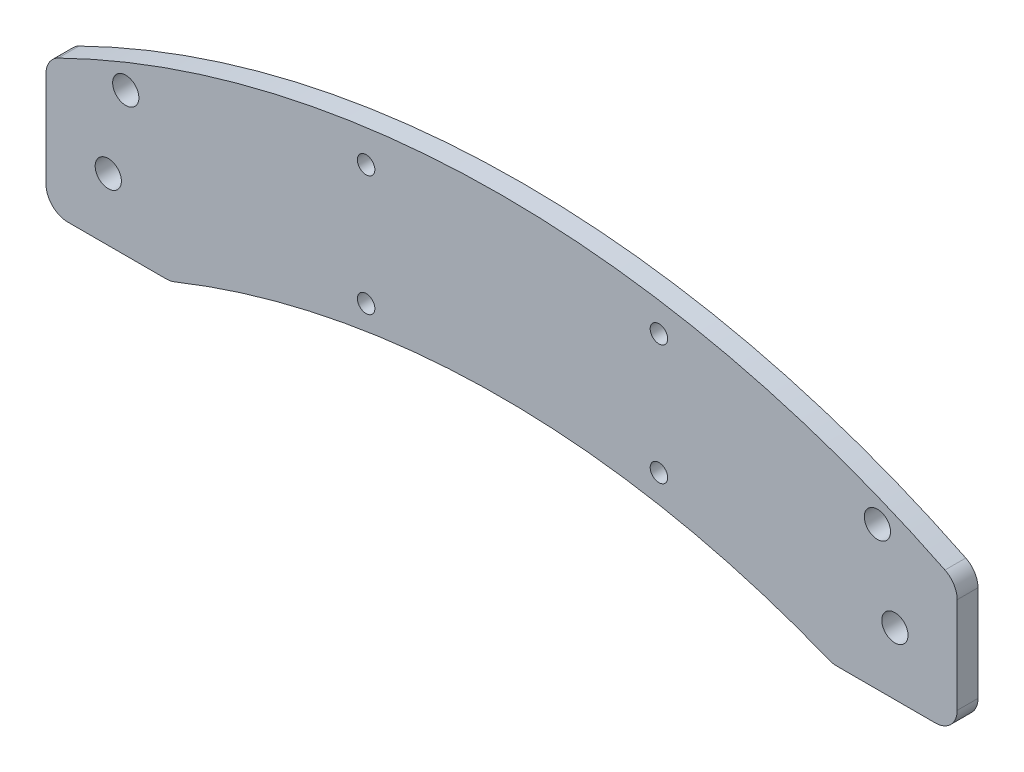
ISO-10303-21;
HEADER;
FILE_DESCRIPTION(('STEP AP214'),'2;1');
FILE_NAME('part.step','',(''),(''),'','','');
FILE_SCHEMA(('AUTOMOTIVE_DESIGN { 1 0 10303 214 1 1 1 1 }'));
ENDSEC;
DATA;
#1=APPLICATION_CONTEXT('core data for automotive mechanical design processes');
#2=APPLICATION_PROTOCOL_DEFINITION('international standard','automotive_design',2000,#1);
#3=PRODUCT_CONTEXT('',#1,'mechanical');
#4=PRODUCT('Part','Part','',(#3));
#5=PRODUCT_RELATED_PRODUCT_CATEGORY('part','',(#4));
#6=PRODUCT_DEFINITION_FORMATION('','',#4);
#7=PRODUCT_DEFINITION_CONTEXT('part definition',#1,'design');
#8=PRODUCT_DEFINITION('design','',#6,#7);
#9=PRODUCT_DEFINITION_SHAPE('','',#8);
#10=(LENGTH_UNIT() NAMED_UNIT(*) SI_UNIT(.MILLI.,.METRE.));
#11=(NAMED_UNIT(*) PLANE_ANGLE_UNIT() SI_UNIT($,.RADIAN.));
#12=(NAMED_UNIT(*) SI_UNIT($,.STERADIAN.) SOLID_ANGLE_UNIT());
#13=UNCERTAINTY_MEASURE_WITH_UNIT(LENGTH_MEASURE(1.E-05),#10,'distance_accuracy_value','');
#14=(GEOMETRIC_REPRESENTATION_CONTEXT(3) GLOBAL_UNCERTAINTY_ASSIGNED_CONTEXT((#13)) GLOBAL_UNIT_ASSIGNED_CONTEXT((#10,
#11,#12)) REPRESENTATION_CONTEXT('',''));
#15=CARTESIAN_POINT('',(0.,0.,0.));
#16=DIRECTION('',(0.,0.,1.));
#17=DIRECTION('',(1.,0.,0.));
#18=AXIS2_PLACEMENT_3D('',#15,#16,#17);
#19=CARTESIAN_POINT('',(86.,32.75,4.763));
#20=DIRECTION('',(0.,0.,1.));
#21=DIRECTION('',(1.,0.,0.));
#22=AXIS2_PLACEMENT_3D('',#19,#20,#21);
#23=CYLINDRICAL_SURFACE('',#22,3.);
#24=CARTESIAN_POINT('',(86.00000000001,32.75000000001,4.76300000001));
#25=DIRECTION('',(0.,0.,-1.));
#26=DIRECTION('',(1.,0.,0.));
#27=AXIS2_PLACEMENT_3D('',#24,#25,#26);
#28=CIRCLE('',#27,3.00000000001);
#29=CARTESIAN_POINT('',(89.00000000002,32.75000000001,4.76300000001));
#30=VERTEX_POINT('',#29);
#31=EDGE_CURVE('E269',#30,#30,#28,.T.);
#32=ORIENTED_EDGE('',*,*,#31,.F.);
#33=EDGE_LOOP('',(#32));
#34=FACE_BOUND('',#33,.T.);
#35=CARTESIAN_POINT('',(86.00000000001,32.75000000001,0.));
#36=DIRECTION('',(0.,0.,1.));
#37=DIRECTION('',(1.,0.,0.));
#38=AXIS2_PLACEMENT_3D('',#35,#36,#37);
#39=CIRCLE('',#38,3.00000000001);
#40=CARTESIAN_POINT('',(89.00000000002,32.75000000001,0.));
#41=VERTEX_POINT('',#40);
#42=EDGE_CURVE('E248',#41,#41,#39,.T.);
#43=ORIENTED_EDGE('',*,*,#42,.F.);
#44=EDGE_LOOP('',(#43));
#45=FACE_BOUND('',#44,.T.);
#46=ADVANCED_FACE('F17',(#34,#45),#23,.F.);
#47=CARTESIAN_POINT('',(-85.99999999998,32.75,4.763));
#48=DIRECTION('',(0.,0.,1.));
#49=DIRECTION('',(1.,0.,0.));
#50=AXIS2_PLACEMENT_3D('',#47,#48,#49);
#51=CYLINDRICAL_SURFACE('',#50,3.);
#52=CARTESIAN_POINT('',(-85.99999999999,32.75000000001,4.76300000001));
#53=DIRECTION('',(0.,0.,-1.));
#54=DIRECTION('',(1.,0.,0.));
#55=AXIS2_PLACEMENT_3D('',#52,#53,#54);
#56=CIRCLE('',#55,3.00000000001);
#57=CARTESIAN_POINT('',(-82.99999999998,32.75000000001,4.76300000001));
#58=VERTEX_POINT('',#57);
#59=EDGE_CURVE('E185',#58,#58,#56,.T.);
#60=ORIENTED_EDGE('',*,*,#59,.F.);
#61=EDGE_LOOP('',(#60));
#62=FACE_BOUND('',#61,.T.);
#63=CARTESIAN_POINT('',(-85.99999999999,32.75000000001,0.));
#64=DIRECTION('',(0.,0.,1.));
#65=DIRECTION('',(1.,0.,0.));
#66=AXIS2_PLACEMENT_3D('',#63,#64,#65);
#67=CIRCLE('',#66,3.00000000001);
#68=CARTESIAN_POINT('',(-82.99999999998,32.75000000001,0.));
#69=VERTEX_POINT('',#68);
#70=EDGE_CURVE('E242',#69,#69,#67,.T.);
#71=ORIENTED_EDGE('',*,*,#70,.F.);
#72=EDGE_LOOP('',(#71));
#73=FACE_BOUND('',#72,.T.);
#74=ADVANCED_FACE('F347',(#62,#73),#51,.F.);
#75=CARTESIAN_POINT('',(36.000000000011,45.5,4.763));
#76=DIRECTION('',(0.,0.,1.));
#77=DIRECTION('',(1.,0.,0.));
#78=AXIS2_PLACEMENT_3D('',#75,#76,#77);
#79=CYLINDRICAL_SURFACE('',#78,2.);
#80=CARTESIAN_POINT('',(36.000000000021,45.50000000001,4.76300000001));
#81=DIRECTION('',(0.,0.,-1.));
#82=DIRECTION('',(1.,0.,0.));
#83=AXIS2_PLACEMENT_3D('',#80,#81,#82);
#84=CIRCLE('',#83,2.00000000001);
#85=CARTESIAN_POINT('',(38.000000000031,45.50000000001,4.76300000001));
#86=VERTEX_POINT('',#85);
#87=EDGE_CURVE('E202',#86,#86,#84,.T.);
#88=ORIENTED_EDGE('',*,*,#87,.F.);
#89=EDGE_LOOP('',(#88));
#90=FACE_BOUND('',#89,.T.);
#91=CARTESIAN_POINT('',(36.000000000021,45.50000000001,0.));
#92=DIRECTION('',(0.,0.,1.));
#93=DIRECTION('',(1.,0.,0.));
#94=AXIS2_PLACEMENT_3D('',#91,#92,#93);
#95=CIRCLE('',#94,2.00000000001);
#96=CARTESIAN_POINT('',(38.000000000031,45.50000000001,0.));
#97=VERTEX_POINT('',#96);
#98=EDGE_CURVE('E227',#97,#97,#95,.T.);
#99=ORIENTED_EDGE('',*,*,#98,.F.);
#100=EDGE_LOOP('',(#99));
#101=FACE_BOUND('',#100,.T.);
#102=ADVANCED_FACE('F353',(#90,#101),#79,.F.);
#103=CARTESIAN_POINT('',(-30.99999999998,45.5,4.763));
#104=DIRECTION('',(0.,0.,1.));
#105=DIRECTION('',(1.,0.,0.));
#106=AXIS2_PLACEMENT_3D('',#103,#104,#105);
#107=CYLINDRICAL_SURFACE('',#106,2.);
#108=CARTESIAN_POINT('',(-30.99999999999,45.50000000001,4.76300000001));
#109=DIRECTION('',(0.,0.,-1.));
#110=DIRECTION('',(1.,0.,0.));
#111=AXIS2_PLACEMENT_3D('',#108,#109,#110);
#112=CIRCLE('',#111,2.00000000001);
#113=CARTESIAN_POINT('',(-28.99999999998,45.50000000001,4.76300000001));
#114=VERTEX_POINT('',#113);
#115=EDGE_CURVE('E206',#114,#114,#112,.T.);
#116=ORIENTED_EDGE('',*,*,#115,.F.);
#117=EDGE_LOOP('',(#116));
#118=FACE_BOUND('',#117,.T.);
#119=CARTESIAN_POINT('',(-30.99999999999,45.50000000001,0.));
#120=DIRECTION('',(0.,0.,1.));
#121=DIRECTION('',(1.,0.,0.));
#122=AXIS2_PLACEMENT_3D('',#119,#120,#121);
#123=CIRCLE('',#122,2.00000000001);
#124=CARTESIAN_POINT('',(-28.99999999998,45.50000000001,0.));
#125=VERTEX_POINT('',#124);
#126=EDGE_CURVE('E223',#125,#125,#123,.T.);
#127=ORIENTED_EDGE('',*,*,#126,.F.);
#128=EDGE_LOOP('',(#127));
#129=FACE_BOUND('',#128,.T.);
#130=ADVANCED_FACE('F386',(#118,#129),#107,.F.);
#131=CARTESIAN_POINT('',(-89.99999999998,14.25,4.763));
#132=DIRECTION('',(0.,0.,1.));
#133=DIRECTION('',(1.,0.,0.));
#134=AXIS2_PLACEMENT_3D('',#131,#132,#133);
#135=CYLINDRICAL_SURFACE('',#134,3.);
#136=CARTESIAN_POINT('',(-89.99999999999,14.25000000001,4.76300000001));
#137=DIRECTION('',(0.,0.,-1.));
#138=DIRECTION('',(1.,0.,0.));
#139=AXIS2_PLACEMENT_3D('',#136,#137,#138);
#140=CIRCLE('',#139,3.00000000001);
#141=CARTESIAN_POINT('',(-86.99999999998,14.25000000001,4.76300000001));
#142=VERTEX_POINT('',#141);
#143=EDGE_CURVE('E212',#142,#142,#140,.T.);
#144=ORIENTED_EDGE('',*,*,#143,.F.);
#145=EDGE_LOOP('',(#144));
#146=FACE_BOUND('',#145,.T.);
#147=CARTESIAN_POINT('',(-89.99999999999,14.25000000001,0.));
#148=DIRECTION('',(0.,0.,1.));
#149=DIRECTION('',(1.,0.,0.));
#150=AXIS2_PLACEMENT_3D('',#147,#148,#149);
#151=CIRCLE('',#150,3.00000000001);
#152=CARTESIAN_POINT('',(-86.99999999998,14.25000000001,0.));
#153=VERTEX_POINT('',#152);
#154=EDGE_CURVE('E200',#153,#153,#151,.T.);
#155=ORIENTED_EDGE('',*,*,#154,.F.);
#156=EDGE_LOOP('',(#155));
#157=FACE_BOUND('',#156,.T.);
#158=ADVANCED_FACE('F389',(#146,#157),#135,.F.);
#159=CARTESIAN_POINT('',(90.,14.25,4.763));
#160=DIRECTION('',(0.,0.,1.));
#161=DIRECTION('',(1.,0.,0.));
#162=AXIS2_PLACEMENT_3D('',#159,#160,#161);
#163=CYLINDRICAL_SURFACE('',#162,3.);
#164=CARTESIAN_POINT('',(90.00000000001,14.25000000001,4.76300000001));
#165=DIRECTION('',(0.,0.,-1.));
#166=DIRECTION('',(1.,0.,0.));
#167=AXIS2_PLACEMENT_3D('',#164,#165,#166);
#168=CIRCLE('',#167,3.00000000001);
#169=CARTESIAN_POINT('',(93.00000000002,14.25000000001,4.76300000001));
#170=VERTEX_POINT('',#169);
#171=EDGE_CURVE('E274',#170,#170,#168,.T.);
#172=ORIENTED_EDGE('',*,*,#171,.F.);
#173=EDGE_LOOP('',(#172));
#174=FACE_BOUND('',#173,.T.);
#175=CARTESIAN_POINT('',(90.00000000001,14.25000000001,0.));
#176=DIRECTION('',(0.,0.,1.));
#177=DIRECTION('',(1.,0.,0.));
#178=AXIS2_PLACEMENT_3D('',#175,#176,#177);
#179=CIRCLE('',#178,3.00000000001);
#180=CARTESIAN_POINT('',(93.00000000002,14.25000000001,0.));
#181=VERTEX_POINT('',#180);
#182=EDGE_CURVE('E196',#181,#181,#179,.T.);
#183=ORIENTED_EDGE('',*,*,#182,.F.);
#184=EDGE_LOOP('',(#183));
#185=FACE_BOUND('',#184,.T.);
#186=ADVANCED_FACE('F379',(#174,#185),#163,.F.);
#187=CARTESIAN_POINT('',(36.000000000011,18.,4.763));
#188=DIRECTION('',(0.,0.,1.));
#189=DIRECTION('',(1.,0.,0.));
#190=AXIS2_PLACEMENT_3D('',#187,#188,#189);
#191=CYLINDRICAL_SURFACE('',#190,2.);
#192=CARTESIAN_POINT('',(36.000000000021,18.00000000001,4.76300000001));
#193=DIRECTION('',(0.,0.,-1.));
#194=DIRECTION('',(1.,0.,0.));
#195=AXIS2_PLACEMENT_3D('',#192,#193,#194);
#196=CIRCLE('',#195,2.00000000001);
#197=CARTESIAN_POINT('',(38.000000000031,18.00000000001,4.76300000001));
#198=VERTEX_POINT('',#197);
#199=EDGE_CURVE('E270',#198,#198,#196,.T.);
#200=ORIENTED_EDGE('',*,*,#199,.F.);
#201=EDGE_LOOP('',(#200));
#202=FACE_BOUND('',#201,.T.);
#203=CARTESIAN_POINT('',(36.000000000021,18.00000000001,0.));
#204=DIRECTION('',(0.,0.,1.));
#205=DIRECTION('',(1.,0.,0.));
#206=AXIS2_PLACEMENT_3D('',#203,#204,#205);
#207=CIRCLE('',#206,2.00000000001);
#208=CARTESIAN_POINT('',(38.000000000031,18.00000000001,0.));
#209=VERTEX_POINT('',#208);
#210=EDGE_CURVE('E201',#209,#209,#207,.T.);
#211=ORIENTED_EDGE('',*,*,#210,.F.);
#212=EDGE_LOOP('',(#211));
#213=FACE_BOUND('',#212,.T.);
#214=ADVANCED_FACE('F392',(#202,#213),#191,.F.);
#215=CARTESIAN_POINT('',(-30.99999999998,18.,4.763));
#216=DIRECTION('',(0.,0.,1.));
#217=DIRECTION('',(1.,0.,0.));
#218=AXIS2_PLACEMENT_3D('',#215,#216,#217);
#219=CYLINDRICAL_SURFACE('',#218,2.);
#220=CARTESIAN_POINT('',(-30.99999999999,18.00000000001,4.76300000001));
#221=DIRECTION('',(0.,0.,-1.));
#222=DIRECTION('',(1.,0.,0.));
#223=AXIS2_PLACEMENT_3D('',#220,#221,#222);
#224=CIRCLE('',#223,2.00000000001);
#225=CARTESIAN_POINT('',(-28.99999999998,18.00000000001,4.76300000001));
#226=VERTEX_POINT('',#225);
#227=EDGE_CURVE('E216',#226,#226,#224,.T.);
#228=ORIENTED_EDGE('',*,*,#227,.F.);
#229=EDGE_LOOP('',(#228));
#230=FACE_BOUND('',#229,.T.);
#231=CARTESIAN_POINT('',(-30.99999999999,18.00000000001,0.));
#232=DIRECTION('',(0.,0.,1.));
#233=DIRECTION('',(1.,0.,0.));
#234=AXIS2_PLACEMENT_3D('',#231,#232,#233);
#235=CIRCLE('',#234,2.00000000001);
#236=CARTESIAN_POINT('',(-28.99999999998,18.00000000001,0.));
#237=VERTEX_POINT('',#236);
#238=EDGE_CURVE('E264',#237,#237,#235,.T.);
#239=ORIENTED_EDGE('',*,*,#238,.F.);
#240=EDGE_LOOP('',(#239));
#241=FACE_BOUND('',#240,.T.);
#242=ADVANCED_FACE('F376',(#230,#241),#219,.F.);
#243=CARTESIAN_POINT('',(75.749521450672,-1.58877355716E-11,0.));
#244=DIRECTION('',(0.,0.,-1.));
#245=DIRECTION('',(0.,-1.,0.));
#246=AXIS2_PLACEMENT_3D('',#243,#244,#245);
#247=PLANE('',#246);
#248=DIRECTION('',(-1.,0.,0.));
#249=VECTOR('',#248,1.);
#250=CARTESIAN_POINT('',(75.749521450682,-1.2787992059439E-11,0.));
#251=LINE('',#250,#249);
#252=CARTESIAN_POINT('',(99.2500000000015,-2.78766713490644E-12,0.));
#253=VERTEX_POINT('',#252);
#254=CARTESIAN_POINT('',(76.7267228545965,-8.89349358046409E-12,0.));
#255=VERTEX_POINT('',#254);
#256=EDGE_CURVE('E11',#253,#255,#251,.T.);
#257=ORIENTED_EDGE('',*,*,#256,.T.);
#258=CARTESIAN_POINT('',(76.726722854605,4.999999999995,0.));
#259=DIRECTION('',(0.,0.,-1.));
#260=DIRECTION('',(1.,0.,0.));
#261=AXIS2_PLACEMENT_3D('',#258,#259,#260);
#262=CIRCLE('',#261,5.00000000001);
#263=CARTESIAN_POINT('',(74.8553393703368,0.363414634131448,0.));
#264=VERTEX_POINT('',#263);
#265=EDGE_CURVE('E28',#255,#264,#262,.T.);
#266=ORIENTED_EDGE('',*,*,#265,.T.);
#267=CARTESIAN_POINT('',(0.,-185.10000000001,0.));
#268=DIRECTION('',(0.,0.,1.));
#269=DIRECTION('',(-1.,0.,0.));
#270=AXIS2_PLACEMENT_3D('',#267,#268,#269);
#271=CIRCLE('',#270,200.00000000001);
#272=CARTESIAN_POINT('',(-74.8553393703311,0.363414634131921,0.));
#273=VERTEX_POINT('',#272);
#274=EDGE_CURVE('E228',#264,#273,#271,.T.);
#275=ORIENTED_EDGE('',*,*,#274,.T.);
#276=CARTESIAN_POINT('',(-76.7267228546,4.999999999995,0.));
#277=DIRECTION('',(0.,0.,-1.));
#278=DIRECTION('',(1.,-2.00173472347197E-12,0.));
#279=AXIS2_PLACEMENT_3D('',#276,#277,#278);
#280=CIRCLE('',#279,5.00000000001);
#281=CARTESIAN_POINT('',(-76.72672285459,-1.54276045547504E-11,0.));
#282=VERTEX_POINT('',#281);
#283=EDGE_CURVE('E77',#273,#282,#280,.T.);
#284=ORIENTED_EDGE('',*,*,#283,.T.);
#285=DIRECTION('',(-1.,0.,0.));
#286=VECTOR('',#285,1.);
#287=CARTESIAN_POINT('',(75.749521450682,-2.543476457755E-11,0.));
#288=LINE('',#287,#286);
#289=CARTESIAN_POINT('',(-99.249999999985,-9.21745318960276E-12,0.));
#290=VERTEX_POINT('',#289);
#291=EDGE_CURVE('E90',#282,#290,#288,.T.);
#292=ORIENTED_EDGE('',*,*,#291,.T.);
#293=CARTESIAN_POINT('',(-99.24999999999,5.000000000007,0.));
#294=DIRECTION('',(0.,0.,-1.));
#295=DIRECTION('',(1.,0.,0.));
#296=AXIS2_PLACEMENT_3D('',#293,#294,#295);
#297=CIRCLE('',#296,5.00000000001);
#298=CARTESIAN_POINT('',(-104.2499999999,4.999999999997,0.));
#299=VERTEX_POINT('',#298);
#300=EDGE_CURVE('E169',#290,#299,#297,.T.);
#301=ORIENTED_EDGE('',*,*,#300,.T.);
#302=DIRECTION('',(0.,1.,0.));
#303=VECTOR('',#302,1.);
#304=CARTESIAN_POINT('',(-104.24999999991,-2.58877355716E-11,0.));
#305=LINE('',#304,#303);
#306=CARTESIAN_POINT('',(-104.24999999994,26.926812236518,0.));
#307=VERTEX_POINT('',#306);
#308=EDGE_CURVE('E300',#299,#307,#305,.T.);
#309=ORIENTED_EDGE('',*,*,#308,.T.);
#310=CARTESIAN_POINT('',(-99.24999999999,26.926812236528,0.));
#311=DIRECTION('',(0.,0.,-1.));
#312=DIRECTION('',(1.,0.,0.));
#313=AXIS2_PLACEMENT_3D('',#310,#311,#312);
#314=CIRCLE('',#313,5.00000000001);
#315=CARTESIAN_POINT('',(-101.455555555523,31.4140747306739,0.));
#316=VERTEX_POINT('',#315);
#317=EDGE_CURVE('E299',#307,#316,#314,.T.);
#318=ORIENTED_EDGE('',*,*,#317,.T.);
#319=CARTESIAN_POINT('',(0.,-175.00000000001,0.));
#320=DIRECTION('',(0.,0.,-1.));
#321=DIRECTION('',(-1.,0.,0.));
#322=AXIS2_PLACEMENT_3D('',#319,#320,#321);
#323=CIRCLE('',#322,230.00000000001);
#324=CARTESIAN_POINT('',(101.455555555553,31.4140747306589,0.));
#325=VERTEX_POINT('',#324);
#326=EDGE_CURVE('E221',#316,#325,#323,.T.);
#327=ORIENTED_EDGE('',*,*,#326,.T.);
#328=CARTESIAN_POINT('',(99.25000000001,26.926812236523,0.));
#329=DIRECTION('',(0.,0.,-1.));
#330=DIRECTION('',(1.,2.00416333633834E-12,0.));
#331=AXIS2_PLACEMENT_3D('',#328,#329,#330);
#332=CIRCLE('',#331,5.00000000001);
#333=CARTESIAN_POINT('',(104.25,26.926812236513,0.));
#334=VERTEX_POINT('',#333);
#335=EDGE_CURVE('E217',#325,#334,#332,.T.);
#336=ORIENTED_EDGE('',*,*,#335,.T.);
#337=DIRECTION('',(0.,-1.,0.));
#338=VECTOR('',#337,1.);
#339=CARTESIAN_POINT('',(104.25000000001,-2.58877355716E-11,0.));
#340=LINE('',#339,#338);
#341=CARTESIAN_POINT('',(104.25,4.999999999997,0.));
#342=VERTEX_POINT('',#341);
#343=EDGE_CURVE('E222',#334,#342,#340,.T.);
#344=ORIENTED_EDGE('',*,*,#343,.T.);
#345=CARTESIAN_POINT('',(99.25000000001,5.000000000007,0.));
#346=DIRECTION('',(0.,0.,-1.));
#347=DIRECTION('',(1.,0.,0.));
#348=AXIS2_PLACEMENT_3D('',#345,#346,#347);
#349=CIRCLE('',#348,5.00000000001);
#350=EDGE_CURVE('E245',#342,#253,#349,.T.);
#351=ORIENTED_EDGE('',*,*,#350,.T.);
#352=EDGE_LOOP('',(#257,#266,#275,#284,#292,#301,#309,#318,#327,#336,#344,#351));
#353=FACE_BOUND('',#352,.T.);
#354=ORIENTED_EDGE('',*,*,#42,.T.);
#355=EDGE_LOOP('',(#354));
#356=FACE_BOUND('',#355,.T.);
#357=ORIENTED_EDGE('',*,*,#70,.T.);
#358=EDGE_LOOP('',(#357));
#359=FACE_BOUND('',#358,.T.);
#360=ORIENTED_EDGE('',*,*,#98,.T.);
#361=EDGE_LOOP('',(#360));
#362=FACE_BOUND('',#361,.T.);
#363=ORIENTED_EDGE('',*,*,#126,.T.);
#364=EDGE_LOOP('',(#363));
#365=FACE_BOUND('',#364,.T.);
#366=ORIENTED_EDGE('',*,*,#154,.T.);
#367=EDGE_LOOP('',(#366));
#368=FACE_BOUND('',#367,.T.);
#369=ORIENTED_EDGE('',*,*,#182,.T.);
#370=EDGE_LOOP('',(#369));
#371=FACE_BOUND('',#370,.T.);
#372=ORIENTED_EDGE('',*,*,#210,.T.);
#373=EDGE_LOOP('',(#372));
#374=FACE_BOUND('',#373,.T.);
#375=ORIENTED_EDGE('',*,*,#238,.T.);
#376=EDGE_LOOP('',(#375));
#377=FACE_BOUND('',#376,.T.);
#378=ADVANCED_FACE('F325',(#353,#356,#359,#362,#365,#368,#371,#374,#377),#247,.T.);
#379=CARTESIAN_POINT('',(76.726722854595,4.999999999985,0.));
#380=DIRECTION('',(0.,0.,1.));
#381=DIRECTION('',(1.,0.,0.));
#382=AXIS2_PLACEMENT_3D('',#379,#380,#381);
#383=CYLINDRICAL_SURFACE('',#382,5.);
#384=CARTESIAN_POINT('',(76.726722854605,4.999999999995,4.76300000001));
#385=DIRECTION('',(0.,0.,-1.));
#386=DIRECTION('',(1.,-2.00260208520996E-12,0.));
#387=AXIS2_PLACEMENT_3D('',#384,#385,#386);
#388=CIRCLE('',#387,5.00000000001);
#389=CARTESIAN_POINT('',(76.7267228545979,-1.51710241591552E-11,4.763));
#390=VERTEX_POINT('',#389);
#391=CARTESIAN_POINT('',(74.8553393703368,0.363414634131448,4.763));
#392=VERTEX_POINT('',#391);
#393=EDGE_CURVE('E306',#390,#392,#388,.T.);
#394=ORIENTED_EDGE('',*,*,#393,.T.);
#395=DIRECTION('',(0.,0.,-1.));
#396=VECTOR('',#395,1.);
#397=CARTESIAN_POINT('',(74.8553393703472,0.363414634141472,0.));
#398=LINE('',#397,#396);
#399=EDGE_CURVE('E21',#392,#264,#398,.T.);
#400=ORIENTED_EDGE('',*,*,#399,.T.);
#401=ORIENTED_EDGE('',*,*,#265,.F.);
#402=DIRECTION('',(0.,0.,1.));
#403=VECTOR('',#402,1.);
#404=CARTESIAN_POINT('',(76.726722854608,-2.49992865350334E-11,0.));
#405=LINE('',#404,#403);
#406=EDGE_CURVE('E253',#255,#390,#405,.T.);
#407=ORIENTED_EDGE('',*,*,#406,.T.);
#408=EDGE_LOOP('',(#394,#400,#401,#407));
#409=FACE_BOUND('',#408,.T.);
#410=ADVANCED_FACE('F319',(#409),#383,.T.);
#411=CARTESIAN_POINT('',(75.749521450672,-1.58877355716E-11,0.));
#412=DIRECTION('',(0.,1.,0.));
#413=DIRECTION('',(1.,0.,5.574550456793E-13));
#414=AXIS2_PLACEMENT_3D('',#411,#412,#413);
#415=PLANE('',#414);
#416=DIRECTION('',(1.,5.67455045679294E-13,0.));
#417=VECTOR('',#416,1.);
#418=CARTESIAN_POINT('',(75.749521450682,-2.58877355716E-11,4.76300000001));
#419=LINE('',#418,#417);
#420=CARTESIAN_POINT('',(99.2500000000029,-2.78726694502574E-12,4.763));
#421=VERTEX_POINT('',#420);
#422=EDGE_CURVE('E174',#390,#421,#419,.T.);
#423=ORIENTED_EDGE('',*,*,#422,.F.);
#424=ORIENTED_EDGE('',*,*,#406,.F.);
#425=ORIENTED_EDGE('',*,*,#256,.F.);
#426=DIRECTION('',(0.,0.,-1.));
#427=VECTOR('',#426,1.);
#428=CARTESIAN_POINT('',(99.250000000013,-1.27872752283973E-11,0.));
#429=LINE('',#428,#427);
#430=EDGE_CURVE('E280',#421,#253,#429,.T.);
#431=ORIENTED_EDGE('',*,*,#430,.F.);
#432=EDGE_LOOP('',(#423,#424,#425,#431));
#433=FACE_BOUND('',#432,.T.);
#434=ADVANCED_FACE('F332',(#433),#415,.F.);
#435=CARTESIAN_POINT('',(99.25,4.999999999997,0.));
#436=DIRECTION('',(0.,0.,1.));
#437=DIRECTION('',(1.,0.,0.));
#438=AXIS2_PLACEMENT_3D('',#435,#436,#437);
#439=CYLINDRICAL_SURFACE('',#438,5.);
#440=CARTESIAN_POINT('',(99.25000000001,5.000000000007,4.76300000001));
#441=DIRECTION('',(0.,0.,-1.));
#442=DIRECTION('',(1.,0.,0.));
#443=AXIS2_PLACEMENT_3D('',#440,#441,#442);
#444=CIRCLE('',#443,5.00000000001);
#445=CARTESIAN_POINT('',(104.25,4.999999999997,4.763));
#446=VERTEX_POINT('',#445);
#447=EDGE_CURVE('E256',#446,#421,#444,.T.);
#448=ORIENTED_EDGE('',*,*,#447,.T.);
#449=ORIENTED_EDGE('',*,*,#430,.T.);
#450=ORIENTED_EDGE('',*,*,#350,.F.);
#451=DIRECTION('',(0.,0.,1.));
#452=VECTOR('',#451,1.);
#453=CARTESIAN_POINT('',(104.25000000001,5.000000000007,0.));
#454=LINE('',#453,#452);
#455=EDGE_CURVE('E189',#342,#446,#454,.T.);
#456=ORIENTED_EDGE('',*,*,#455,.T.);
#457=EDGE_LOOP('',(#448,#449,#450,#456));
#458=FACE_BOUND('',#457,.T.);
#459=ADVANCED_FACE('F364',(#458),#439,.T.);
#460=CARTESIAN_POINT('',(104.25,30.016920033448,0.));
#461=DIRECTION('',(1.,0.,0.));
#462=DIRECTION('',(0.,1.,0.));
#463=AXIS2_PLACEMENT_3D('',#460,#461,#462);
#464=PLANE('',#463);
#465=DIRECTION('',(0.,-1.,0.));
#466=VECTOR('',#465,1.);
#467=CARTESIAN_POINT('',(104.25000000001,30.016920033458,4.76300000001));
#468=LINE('',#467,#466);
#469=CARTESIAN_POINT('',(104.25,26.926812236513,4.763));
#470=VERTEX_POINT('',#469);
#471=EDGE_CURVE('E233',#470,#446,#468,.T.);
#472=ORIENTED_EDGE('',*,*,#471,.T.);
#473=ORIENTED_EDGE('',*,*,#455,.F.);
#474=ORIENTED_EDGE('',*,*,#343,.F.);
#475=DIRECTION('',(0.,0.,1.));
#476=VECTOR('',#475,1.);
#477=CARTESIAN_POINT('',(104.25000000001,26.926812236523,0.));
#478=LINE('',#477,#476);
#479=EDGE_CURVE('E230',#334,#470,#478,.T.);
#480=ORIENTED_EDGE('',*,*,#479,.T.);
#481=EDGE_LOOP('',(#472,#473,#474,#480));
#482=FACE_BOUND('',#481,.T.);
#483=ADVANCED_FACE('F361',(#482),#464,.T.);
#484=CARTESIAN_POINT('',(99.25,26.926812236513,0.));
#485=DIRECTION('',(0.,0.,1.));
#486=DIRECTION('',(1.,0.,0.));
#487=AXIS2_PLACEMENT_3D('',#484,#485,#486);
#488=CYLINDRICAL_SURFACE('',#487,5.);
#489=CARTESIAN_POINT('',(99.25000000001,26.926812236523,4.76300000001));
#490=DIRECTION('',(0.,0.,-1.));
#491=DIRECTION('',(1.,2.00416333633834E-12,0.));
#492=AXIS2_PLACEMENT_3D('',#489,#490,#491);
#493=CIRCLE('',#492,5.00000000001);
#494=CARTESIAN_POINT('',(101.455555555553,31.4140747306589,4.763));
#495=VERTEX_POINT('',#494);
#496=EDGE_CURVE('E234',#495,#470,#493,.T.);
#497=ORIENTED_EDGE('',*,*,#496,.T.);
#498=ORIENTED_EDGE('',*,*,#479,.F.);
#499=ORIENTED_EDGE('',*,*,#335,.F.);
#500=DIRECTION('',(0.,0.,1.));
#501=VECTOR('',#500,1.);
#502=CARTESIAN_POINT('',(101.455555555561,31.41407473067,0.));
#503=LINE('',#502,#501);
#504=EDGE_CURVE('E235',#325,#495,#503,.T.);
#505=ORIENTED_EDGE('',*,*,#504,.T.);
#506=EDGE_LOOP('',(#497,#498,#499,#505));
#507=FACE_BOUND('',#506,.T.);
#508=ADVANCED_FACE('F363',(#507),#488,.T.);
#509=CARTESIAN_POINT('',(0.,-175.,0.));
#510=DIRECTION('',(0.,0.,-1.));
#511=DIRECTION('',(-1.,0.,0.));
#512=AXIS2_PLACEMENT_3D('',#509,#510,#511);
#513=CYLINDRICAL_SURFACE('',#512,230.);
#514=ORIENTED_EDGE('',*,*,#504,.F.);
#515=ORIENTED_EDGE('',*,*,#326,.F.);
#516=DIRECTION('',(0.,0.,1.));
#517=VECTOR('',#516,1.);
#518=CARTESIAN_POINT('',(-101.455555555519,31.4140747306908,0.));
#519=LINE('',#518,#517);
#520=CARTESIAN_POINT('',(-101.455555555522,31.4140747306718,4.763));
#521=VERTEX_POINT('',#520);
#522=EDGE_CURVE('E238',#316,#521,#519,.T.);
#523=ORIENTED_EDGE('',*,*,#522,.T.);
#524=CARTESIAN_POINT('',(0.,-175.00000000001,4.76300000001));
#525=DIRECTION('',(0.,0.,-1.));
#526=DIRECTION('',(-1.,0.,0.));
#527=AXIS2_PLACEMENT_3D('',#524,#525,#526);
#528=CIRCLE('',#527,230.00000000001);
#529=EDGE_CURVE('E259',#521,#495,#528,.T.);
#530=ORIENTED_EDGE('',*,*,#529,.T.);
#531=EDGE_LOOP('',(#514,#515,#523,#530));
#532=FACE_BOUND('',#531,.T.);
#533=ADVANCED_FACE('F382',(#532),#513,.T.);
#534=CARTESIAN_POINT('',(-99.24999999998,26.926812236518,0.));
#535=DIRECTION('',(0.,0.,1.));
#536=DIRECTION('',(1.,0.,0.));
#537=AXIS2_PLACEMENT_3D('',#534,#535,#536);
#538=CYLINDRICAL_SURFACE('',#537,5.);
#539=ORIENTED_EDGE('',*,*,#522,.F.);
#540=ORIENTED_EDGE('',*,*,#317,.F.);
#541=DIRECTION('',(0.,0.,1.));
#542=VECTOR('',#541,1.);
#543=CARTESIAN_POINT('',(-104.24999999999,26.926812236528,0.));
#544=LINE('',#543,#542);
#545=CARTESIAN_POINT('',(-104.24999999994,26.926812236518,4.763));
#546=VERTEX_POINT('',#545);
#547=EDGE_CURVE('E211',#307,#546,#544,.T.);
#548=ORIENTED_EDGE('',*,*,#547,.T.);
#549=CARTESIAN_POINT('',(-99.24999999999,26.926812236528,4.76300000001));
#550=DIRECTION('',(0.,0.,-1.));
#551=DIRECTION('',(1.,-2.00555111511911E-12,0.));
#552=AXIS2_PLACEMENT_3D('',#549,#550,#551);
#553=CIRCLE('',#552,5.00000000001);
#554=EDGE_CURVE('E207',#546,#521,#553,.T.);
#555=ORIENTED_EDGE('',*,*,#554,.T.);
#556=EDGE_LOOP('',(#539,#540,#548,#555));
#557=FACE_BOUND('',#556,.T.);
#558=ADVANCED_FACE('F19',(#557),#538,.T.);
#559=CARTESIAN_POINT('',(-104.2499999999,0.,0.));
#560=DIRECTION('',(-1.,0.,0.));
#561=DIRECTION('',(0.,0.,1.));
#562=AXIS2_PLACEMENT_3D('',#559,#560,#561);
#563=PLANE('',#562);
#564=DIRECTION('',(0.,1.,0.));
#565=VECTOR('',#564,1.);
#566=CARTESIAN_POINT('',(-104.24999999991,0.,4.76300000001));
#567=LINE('',#566,#565);
#568=CARTESIAN_POINT('',(-104.2499999999,4.999999999997,4.763));
#569=VERTEX_POINT('',#568);
#570=EDGE_CURVE('E161',#569,#546,#567,.T.);
#571=ORIENTED_EDGE('',*,*,#570,.T.);
#572=ORIENTED_EDGE('',*,*,#547,.F.);
#573=ORIENTED_EDGE('',*,*,#308,.F.);
#574=DIRECTION('',(0.,0.,1.));
#575=VECTOR('',#574,1.);
#576=CARTESIAN_POINT('',(-104.24999999991,5.000000000007,0.));
#577=LINE('',#576,#575);
#578=EDGE_CURVE('E170',#299,#569,#577,.T.);
#579=ORIENTED_EDGE('',*,*,#578,.T.);
#580=EDGE_LOOP('',(#571,#572,#573,#579));
#581=FACE_BOUND('',#580,.T.);
#582=ADVANCED_FACE('F441',(#581),#563,.T.);
#583=CARTESIAN_POINT('',(-99.24999999998,4.999999999997,0.));
#584=DIRECTION('',(0.,0.,1.));
#585=DIRECTION('',(1.,0.,0.));
#586=AXIS2_PLACEMENT_3D('',#583,#584,#585);
#587=CYLINDRICAL_SURFACE('',#586,5.);
#588=ORIENTED_EDGE('',*,*,#578,.F.);
#589=ORIENTED_EDGE('',*,*,#300,.F.);
#590=DIRECTION('',(0.,0.,1.));
#591=VECTOR('',#590,1.);
#592=CARTESIAN_POINT('',(-99.25,-1.30002042517019E-11,0.));
#593=LINE('',#592,#591);
#594=CARTESIAN_POINT('',(-99.2499999999864,-2.90132501357121E-12,4.763));
#595=VERTEX_POINT('',#594);
#596=EDGE_CURVE('E164',#290,#595,#593,.T.);
#597=ORIENTED_EDGE('',*,*,#596,.T.);
#598=CARTESIAN_POINT('',(-99.24999999999,5.000000000007,4.76300000001));
#599=DIRECTION('',(0.,0.,-1.));
#600=DIRECTION('',(1.,0.,0.));
#601=AXIS2_PLACEMENT_3D('',#598,#599,#600);
#602=CIRCLE('',#601,5.00000000001);
#603=EDGE_CURVE('E156',#595,#569,#602,.T.);
#604=ORIENTED_EDGE('',*,*,#603,.T.);
#605=EDGE_LOOP('',(#588,#589,#597,#604));
#606=FACE_BOUND('',#605,.T.);
#607=ADVANCED_FACE('F167',(#606),#587,.T.);
#608=CARTESIAN_POINT('',(-104.2499999999,0.,0.));
#609=DIRECTION('',(0.,1.,0.));
#610=DIRECTION('',(1.,0.,-5.604467543324E-13));
#611=AXIS2_PLACEMENT_3D('',#608,#609,#610);
#612=PLANE('',#611);
#613=DIRECTION('',(1.,-5.70446754332394E-13,0.));
#614=VECTOR('',#613,1.);
#615=CARTESIAN_POINT('',(-104.24999999991,0.,4.76300000001));
#616=LINE('',#615,#614);
#617=CARTESIAN_POINT('',(-76.7267228545914,-1.54252462465329E-11,4.763));
#618=VERTEX_POINT('',#617);
#619=EDGE_CURVE('E148',#595,#618,#616,.T.);
#620=ORIENTED_EDGE('',*,*,#619,.F.);
#621=ORIENTED_EDGE('',*,*,#596,.F.);
#622=ORIENTED_EDGE('',*,*,#291,.F.);
#623=DIRECTION('',(0.,0.,-1.));
#624=VECTOR('',#623,1.);
#625=CARTESIAN_POINT('',(-76.7267228546,-2.54253313446801E-11,0.));
#626=LINE('',#625,#624);
#627=EDGE_CURVE('E165',#618,#282,#626,.T.);
#628=ORIENTED_EDGE('',*,*,#627,.F.);
#629=EDGE_LOOP('',(#620,#621,#622,#628));
#630=FACE_BOUND('',#629,.T.);
#631=ADVANCED_FACE('F172',(#630),#612,.F.);
#632=CARTESIAN_POINT('',(-76.72672285459,4.999999999985,0.));
#633=DIRECTION('',(0.,0.,1.));
#634=DIRECTION('',(1.,0.,0.));
#635=AXIS2_PLACEMENT_3D('',#632,#633,#634);
#636=CYLINDRICAL_SURFACE('',#635,5.);
#637=ORIENTED_EDGE('',*,*,#627,.T.);
#638=ORIENTED_EDGE('',*,*,#283,.F.);
#639=DIRECTION('',(0.,0.,1.));
#640=VECTOR('',#639,1.);
#641=CARTESIAN_POINT('',(-74.8553393703405,0.363414634142164,0.));
#642=LINE('',#641,#640);
#643=CARTESIAN_POINT('',(-74.8553393703314,0.363414634132653,4.763));
#644=VERTEX_POINT('',#643);
#645=EDGE_CURVE('E191',#273,#644,#642,.T.);
#646=ORIENTED_EDGE('',*,*,#645,.T.);
#647=CARTESIAN_POINT('',(-76.7267228546,4.999999999995,4.76300000001));
#648=DIRECTION('',(0.,0.,-1.));
#649=DIRECTION('',(1.,2.00346944694794E-12,0.));
#650=AXIS2_PLACEMENT_3D('',#647,#648,#649);
#651=CIRCLE('',#650,5.00000000001);
#652=EDGE_CURVE('E181',#644,#618,#651,.T.);
#653=ORIENTED_EDGE('',*,*,#652,.T.);
#654=EDGE_LOOP('',(#637,#638,#646,#653));
#655=FACE_BOUND('',#654,.T.);
#656=ADVANCED_FACE('F334',(#655),#636,.T.);
#657=CARTESIAN_POINT('',(0.,-185.1,0.));
#658=DIRECTION('',(0.,0.,-1.));
#659=DIRECTION('',(-1.,0.,0.));
#660=AXIS2_PLACEMENT_3D('',#657,#658,#659);
#661=CYLINDRICAL_SURFACE('',#660,200.);
#662=ORIENTED_EDGE('',*,*,#399,.F.);
#663=CARTESIAN_POINT('',(0.,-185.10000000001,4.76300000001));
#664=DIRECTION('',(0.,0.,-1.));
#665=DIRECTION('',(-1.,0.,0.));
#666=AXIS2_PLACEMENT_3D('',#663,#664,#665);
#667=CIRCLE('',#666,200.00000000001);
#668=EDGE_CURVE('E175',#644,#392,#667,.T.);
#669=ORIENTED_EDGE('',*,*,#668,.F.);
#670=ORIENTED_EDGE('',*,*,#645,.F.);
#671=ORIENTED_EDGE('',*,*,#274,.F.);
#672=EDGE_LOOP('',(#662,#669,#670,#671));
#673=FACE_BOUND('',#672,.T.);
#674=ADVANCED_FACE('F322',(#673),#661,.F.);
#675=CARTESIAN_POINT('',(75.749521450672,-1.58877355716E-11,4.763));
#676=DIRECTION('',(0.,0.,-1.));
#677=DIRECTION('',(0.,-1.,0.));
#678=AXIS2_PLACEMENT_3D('',#675,#676,#677);
#679=PLANE('',#678);
#680=ORIENTED_EDGE('',*,*,#422,.T.);
#681=ORIENTED_EDGE('',*,*,#447,.F.);
#682=ORIENTED_EDGE('',*,*,#471,.F.);
#683=ORIENTED_EDGE('',*,*,#496,.F.);
#684=ORIENTED_EDGE('',*,*,#529,.F.);
#685=ORIENTED_EDGE('',*,*,#554,.F.);
#686=ORIENTED_EDGE('',*,*,#570,.F.);
#687=ORIENTED_EDGE('',*,*,#603,.F.);
#688=ORIENTED_EDGE('',*,*,#619,.T.);
#689=ORIENTED_EDGE('',*,*,#652,.F.);
#690=ORIENTED_EDGE('',*,*,#668,.T.);
#691=ORIENTED_EDGE('',*,*,#393,.F.);
#692=EDGE_LOOP('',(#680,#681,#682,#683,#684,#685,#686,#687,#688,#689,#690,#691));
#693=FACE_BOUND('',#692,.T.);
#694=ORIENTED_EDGE('',*,*,#59,.T.);
#695=EDGE_LOOP('',(#694));
#696=FACE_BOUND('',#695,.T.);
#697=ORIENTED_EDGE('',*,*,#87,.T.);
#698=EDGE_LOOP('',(#697));
#699=FACE_BOUND('',#698,.T.);
#700=ORIENTED_EDGE('',*,*,#115,.T.);
#701=EDGE_LOOP('',(#700));
#702=FACE_BOUND('',#701,.T.);
#703=ORIENTED_EDGE('',*,*,#31,.T.);
#704=EDGE_LOOP('',(#703));
#705=FACE_BOUND('',#704,.T.);
#706=ORIENTED_EDGE('',*,*,#171,.T.);
#707=EDGE_LOOP('',(#706));
#708=FACE_BOUND('',#707,.T.);
#709=ORIENTED_EDGE('',*,*,#199,.T.);
#710=EDGE_LOOP('',(#709));
#711=FACE_BOUND('',#710,.T.);
#712=ORIENTED_EDGE('',*,*,#227,.T.);
#713=EDGE_LOOP('',(#712));
#714=FACE_BOUND('',#713,.T.);
#715=ORIENTED_EDGE('',*,*,#143,.T.);
#716=EDGE_LOOP('',(#715));
#717=FACE_BOUND('',#716,.T.);
#718=ADVANCED_FACE('F158',(#693,#696,#699,#702,#705,#708,#711,#714,#717),#679,.F.);
#719=CLOSED_SHELL('',(#46,#74,#102,#130,#158,#186,#214,#242,#378,#410,#434,#459,#483,#508,#533,
#558,#582,#607,#631,#656,#674,#718));
#720=MANIFOLD_SOLID_BREP('B1',#719);
#721=ADVANCED_BREP_SHAPE_REPRESENTATION('',(#18,#720),#14);
#722=SHAPE_DEFINITION_REPRESENTATION(#9,#721);
ENDSEC;
END-ISO-10303-21;
